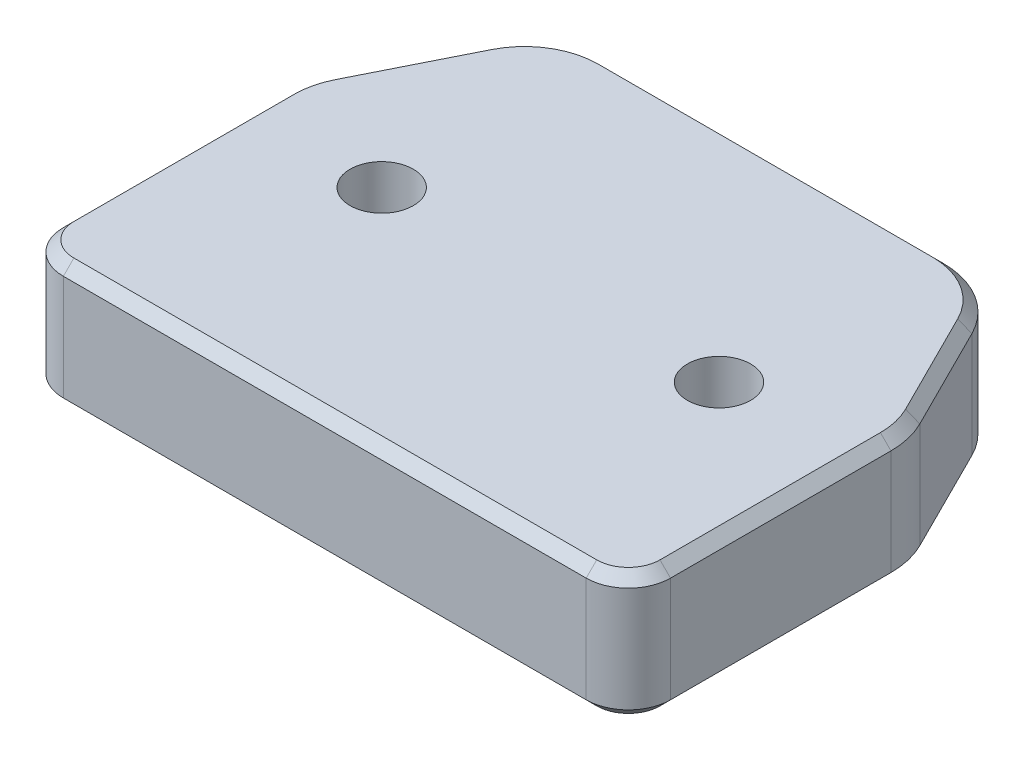
ISO-10303-21;
HEADER;
FILE_DESCRIPTION(('STEP AP214'),'2;1');
FILE_NAME('part.step','',(''),(''),'','','');
FILE_SCHEMA(('AUTOMOTIVE_DESIGN { 1 0 10303 214 1 1 1 1 }'));
ENDSEC;
DATA;
#1=APPLICATION_CONTEXT('core data for automotive mechanical design processes');
#2=APPLICATION_PROTOCOL_DEFINITION('international standard','automotive_design',2000,#1);
#3=PRODUCT_CONTEXT('',#1,'mechanical');
#4=PRODUCT('Part','Part','',(#3));
#5=PRODUCT_RELATED_PRODUCT_CATEGORY('part','',(#4));
#6=PRODUCT_DEFINITION_FORMATION('','',#4);
#7=PRODUCT_DEFINITION_CONTEXT('part definition',#1,'design');
#8=PRODUCT_DEFINITION('design','',#6,#7);
#9=PRODUCT_DEFINITION_SHAPE('','',#8);
#10=(LENGTH_UNIT() NAMED_UNIT(*) SI_UNIT(.MILLI.,.METRE.));
#11=(NAMED_UNIT(*) PLANE_ANGLE_UNIT() SI_UNIT($,.RADIAN.));
#12=(NAMED_UNIT(*) SI_UNIT($,.STERADIAN.) SOLID_ANGLE_UNIT());
#13=UNCERTAINTY_MEASURE_WITH_UNIT(LENGTH_MEASURE(1.E-05),#10,'distance_accuracy_value','');
#14=(GEOMETRIC_REPRESENTATION_CONTEXT(3) GLOBAL_UNCERTAINTY_ASSIGNED_CONTEXT((#13)) GLOBAL_UNIT_ASSIGNED_CONTEXT((#10,
#11,#12)) REPRESENTATION_CONTEXT('',''));
#15=CARTESIAN_POINT('',(0.,0.,0.));
#16=DIRECTION('',(0.,0.,1.));
#17=DIRECTION('',(1.,0.,0.));
#18=AXIS2_PLACEMENT_3D('',#15,#16,#17);
#19=CARTESIAN_POINT('',(12.6,6.,-6.3));
#20=DIRECTION('',(0.894427190999916,0.,-0.447213595499958));
#21=DIRECTION('',(-0.447213595499958,0.,-0.894427190999916));
#22=AXIS2_PLACEMENT_3D('',#19,#20,#21);
#23=PLANE('',#22);
#24=DIRECTION('',(0.,-1.,0.));
#25=VECTOR('',#24,1.);
#26=CARTESIAN_POINT('',(13.9777087639997,0.,-3.54458247200067));
#27=LINE('',#26,#25);
#28=CARTESIAN_POINT('',(13.9777087639997,5.5,-3.54458247200067));
#29=VERTEX_POINT('',#28);
#30=CARTESIAN_POINT('',(13.9777087639997,0.500000000000004,-3.54458247200067));
#31=VERTEX_POINT('',#30);
#32=EDGE_CURVE('E546',#29,#31,#27,.T.);
#33=ORIENTED_EDGE('',*,*,#32,.T.);
#34=DIRECTION('',(-0.447213595499958,0.,-0.894427190999916));
#35=VECTOR('',#34,1.);
#36=CARTESIAN_POINT('',(11.5055728090001,0.500000000000004,-8.48885438199983));
#37=LINE('',#36,#35);
#38=CARTESIAN_POINT('',(11.5055728090001,0.500000000000004,-8.48885438199983));
#39=VERTEX_POINT('',#38);
#40=EDGE_CURVE('E343',#31,#39,#37,.T.);
#41=ORIENTED_EDGE('',*,*,#40,.T.);
#42=DIRECTION('',(0.,-1.,0.));
#43=VECTOR('',#42,1.);
#44=CARTESIAN_POINT('',(11.5055728090001,6.,-8.48885438199983));
#45=LINE('',#44,#43);
#46=CARTESIAN_POINT('',(11.5055728090001,5.5,-8.48885438199983));
#47=VERTEX_POINT('',#46);
#48=EDGE_CURVE('E537',#39,#47,#45,.F.);
#49=ORIENTED_EDGE('',*,*,#48,.T.);
#50=DIRECTION('',(0.447213595499958,0.,0.894427190999916));
#51=VECTOR('',#50,1.);
#52=CARTESIAN_POINT('',(12.6,5.5,-6.3));
#53=LINE('',#52,#51);
#54=EDGE_CURVE('E351',#47,#29,#53,.T.);
#55=ORIENTED_EDGE('',*,*,#54,.T.);
#56=EDGE_LOOP('',(#33,#41,#49,#55));
#57=FACE_BOUND('',#56,.T.);
#58=ADVANCED_FACE('F47',(#57),#23,.T.);
#59=CARTESIAN_POINT('',(0.,6.,-10.7));
#60=DIRECTION('',(0.,0.,-1.));
#61=DIRECTION('',(-1.,0.,0.));
#62=AXIS2_PLACEMENT_3D('',#59,#60,#61);
#63=PLANE('',#62);
#64=DIRECTION('',(0.,-1.,0.));
#65=VECTOR('',#64,1.);
#66=CARTESIAN_POINT('',(7.92786404500042,6.,-10.7));
#67=LINE('',#66,#65);
#68=CARTESIAN_POINT('',(7.92786404500042,5.5,-10.7));
#69=VERTEX_POINT('',#68);
#70=CARTESIAN_POINT('',(7.92786404500042,0.500000000000004,-10.7));
#71=VERTEX_POINT('',#70);
#72=EDGE_CURVE('E553',#69,#71,#67,.T.);
#73=ORIENTED_EDGE('',*,*,#72,.T.);
#74=DIRECTION('',(-1.,0.,0.));
#75=VECTOR('',#74,1.);
#76=CARTESIAN_POINT('',(-7.92786404500042,0.500000000000004,-10.7));
#77=LINE('',#76,#75);
#78=CARTESIAN_POINT('',(-7.92786404500042,0.500000000000004,-10.7));
#79=VERTEX_POINT('',#78);
#80=EDGE_CURVE('E447',#71,#79,#77,.T.);
#81=ORIENTED_EDGE('',*,*,#80,.T.);
#82=DIRECTION('',(0.,-1.,0.));
#83=VECTOR('',#82,1.);
#84=CARTESIAN_POINT('',(-7.92786404500042,6.,-10.7));
#85=LINE('',#84,#83);
#86=CARTESIAN_POINT('',(-7.92786404500042,5.5,-10.7));
#87=VERTEX_POINT('',#86);
#88=EDGE_CURVE('E557',#79,#87,#85,.F.);
#89=ORIENTED_EDGE('',*,*,#88,.T.);
#90=DIRECTION('',(1.,0.,0.));
#91=VECTOR('',#90,1.);
#92=CARTESIAN_POINT('',(0.,5.5,-10.7));
#93=LINE('',#92,#91);
#94=EDGE_CURVE('E444',#87,#69,#93,.T.);
#95=ORIENTED_EDGE('',*,*,#94,.T.);
#96=EDGE_LOOP('',(#73,#81,#89,#95));
#97=FACE_BOUND('',#96,.T.);
#98=ADVANCED_FACE('F616',(#97),#63,.T.);
#99=CARTESIAN_POINT('',(-12.6,6.,-6.3));
#100=DIRECTION('',(-0.894427190999916,0.,-0.447213595499958));
#101=DIRECTION('',(-0.447213595499958,0.,0.894427190999916));
#102=AXIS2_PLACEMENT_3D('',#99,#100,#101);
#103=PLANE('',#102);
#104=DIRECTION('',(0.,-1.,0.));
#105=VECTOR('',#104,1.);
#106=CARTESIAN_POINT('',(-11.5055728090001,6.,-8.48885438199983));
#107=LINE('',#106,#105);
#108=CARTESIAN_POINT('',(-11.5055728090001,5.5,-8.48885438199983));
#109=VERTEX_POINT('',#108);
#110=CARTESIAN_POINT('',(-11.5055728090001,0.500000000000004,-8.48885438199983));
#111=VERTEX_POINT('',#110);
#112=EDGE_CURVE('E524',#109,#111,#107,.T.);
#113=ORIENTED_EDGE('',*,*,#112,.T.);
#114=DIRECTION('',(-0.447213595499958,0.,0.894427190999916));
#115=VECTOR('',#114,1.);
#116=CARTESIAN_POINT('',(-13.9777087639997,0.500000000000004,-3.54458247200066));
#117=LINE('',#116,#115);
#118=CARTESIAN_POINT('',(-13.9777087639997,0.500000000000004,-3.54458247200066));
#119=VERTEX_POINT('',#118);
#120=EDGE_CURVE('E422',#111,#119,#117,.T.);
#121=ORIENTED_EDGE('',*,*,#120,.T.);
#122=DIRECTION('',(0.,-1.,0.));
#123=VECTOR('',#122,1.);
#124=CARTESIAN_POINT('',(-13.9777087639997,6.,-3.54458247200066));
#125=LINE('',#124,#123);
#126=CARTESIAN_POINT('',(-13.9777087639997,5.5,-3.54458247200066));
#127=VERTEX_POINT('',#126);
#128=EDGE_CURVE('E525',#119,#127,#125,.F.);
#129=ORIENTED_EDGE('',*,*,#128,.T.);
#130=DIRECTION('',(0.447213595499958,0.,-0.894427190999916));
#131=VECTOR('',#130,1.);
#132=CARTESIAN_POINT('',(-12.6,5.5,-6.3));
#133=LINE('',#132,#131);
#134=EDGE_CURVE('E429',#127,#109,#133,.T.);
#135=ORIENTED_EDGE('',*,*,#134,.T.);
#136=EDGE_LOOP('',(#113,#121,#129,#135));
#137=FACE_BOUND('',#136,.T.);
#138=ADVANCED_FACE('F523',(#137),#103,.T.);
#139=CARTESIAN_POINT('',(-14.4,6.,0.));
#140=DIRECTION('',(-1.,0.,0.));
#141=DIRECTION('',(0.,0.,1.));
#142=AXIS2_PLACEMENT_3D('',#139,#140,#141);
#143=PLANE('',#142);
#144=DIRECTION('',(0.,-1.,0.));
#145=VECTOR('',#144,1.);
#146=CARTESIAN_POINT('',(-14.4,6.,-1.75572809000083));
#147=LINE('',#146,#145);
#148=CARTESIAN_POINT('',(-14.4,5.5,-1.75572809000083));
#149=VERTEX_POINT('',#148);
#150=CARTESIAN_POINT('',(-14.4,0.500000000000004,-1.75572809000083));
#151=VERTEX_POINT('',#150);
#152=EDGE_CURVE('E533',#149,#151,#147,.T.);
#153=ORIENTED_EDGE('',*,*,#152,.T.);
#154=DIRECTION('',(0.,0.,1.));
#155=VECTOR('',#154,1.);
#156=CARTESIAN_POINT('',(-14.4,0.500000000000004,8.7));
#157=LINE('',#156,#155);
#158=CARTESIAN_POINT('',(-14.4,0.500000000000004,8.7));
#159=VERTEX_POINT('',#158);
#160=EDGE_CURVE('E441',#151,#159,#157,.T.);
#161=ORIENTED_EDGE('',*,*,#160,.T.);
#162=DIRECTION('',(0.,-1.,0.));
#163=VECTOR('',#162,1.);
#164=CARTESIAN_POINT('',(-14.4,6.,8.7));
#165=LINE('',#164,#163);
#166=CARTESIAN_POINT('',(-14.4,5.5,8.7));
#167=VERTEX_POINT('',#166);
#168=EDGE_CURVE('E237',#159,#167,#165,.F.);
#169=ORIENTED_EDGE('',*,*,#168,.T.);
#170=DIRECTION('',(0.,0.,-1.));
#171=VECTOR('',#170,1.);
#172=CARTESIAN_POINT('',(-14.4,5.5,0.));
#173=LINE('',#172,#171);
#174=EDGE_CURVE('E438',#167,#149,#173,.T.);
#175=ORIENTED_EDGE('',*,*,#174,.T.);
#176=EDGE_LOOP('',(#153,#161,#169,#175));
#177=FACE_BOUND('',#176,.T.);
#178=ADVANCED_FACE('F570',(#177),#143,.T.);
#179=CARTESIAN_POINT('',(0.,6.,10.7));
#180=DIRECTION('',(0.,0.,-1.));
#181=DIRECTION('',(-1.,0.,0.));
#182=AXIS2_PLACEMENT_3D('',#179,#180,#181);
#183=PLANE('',#182);
#184=DIRECTION('',(0.,-1.,0.));
#185=VECTOR('',#184,1.);
#186=CARTESIAN_POINT('',(-12.4,0.,10.7));
#187=LINE('',#186,#185);
#188=CARTESIAN_POINT('',(-12.4,5.5,10.7));
#189=VERTEX_POINT('',#188);
#190=CARTESIAN_POINT('',(-12.4,0.500000000000004,10.7));
#191=VERTEX_POINT('',#190);
#192=EDGE_CURVE('E474',#189,#191,#187,.T.);
#193=ORIENTED_EDGE('',*,*,#192,.T.);
#194=DIRECTION('',(1.,0.,0.));
#195=VECTOR('',#194,1.);
#196=CARTESIAN_POINT('',(0.,0.500000000000004,10.7));
#197=LINE('',#196,#195);
#198=CARTESIAN_POINT('',(12.4,0.500000000000004,10.7));
#199=VERTEX_POINT('',#198);
#200=EDGE_CURVE('E357',#191,#199,#197,.T.);
#201=ORIENTED_EDGE('',*,*,#200,.T.);
#202=DIRECTION('',(0.,-1.,0.));
#203=VECTOR('',#202,1.);
#204=CARTESIAN_POINT('',(12.4,6.,10.7));
#205=LINE('',#204,#203);
#206=CARTESIAN_POINT('',(12.4,5.5,10.7));
#207=VERTEX_POINT('',#206);
#208=EDGE_CURVE('E471',#199,#207,#205,.F.);
#209=ORIENTED_EDGE('',*,*,#208,.T.);
#210=DIRECTION('',(-1.,0.,0.));
#211=VECTOR('',#210,1.);
#212=CARTESIAN_POINT('',(-12.4,5.5,10.7));
#213=LINE('',#212,#211);
#214=EDGE_CURVE('E462',#207,#189,#213,.T.);
#215=ORIENTED_EDGE('',*,*,#214,.T.);
#216=EDGE_LOOP('',(#193,#201,#209,#215));
#217=FACE_BOUND('',#216,.T.);
#218=ADVANCED_FACE('F470',(#217),#183,.F.);
#219=CARTESIAN_POINT('',(14.4,6.,0.));
#220=DIRECTION('',(-1.,0.,0.));
#221=DIRECTION('',(0.,0.,1.));
#222=AXIS2_PLACEMENT_3D('',#219,#220,#221);
#223=PLANE('',#222);
#224=DIRECTION('',(0.,-1.,0.));
#225=VECTOR('',#224,1.);
#226=CARTESIAN_POINT('',(14.4,6.,8.7));
#227=LINE('',#226,#225);
#228=CARTESIAN_POINT('',(14.4,5.5,8.7));
#229=VERTEX_POINT('',#228);
#230=CARTESIAN_POINT('',(14.4,0.500000000000004,8.7));
#231=VERTEX_POINT('',#230);
#232=EDGE_CURVE('E560',#229,#231,#227,.T.);
#233=ORIENTED_EDGE('',*,*,#232,.T.);
#234=DIRECTION('',(0.,0.,-1.));
#235=VECTOR('',#234,1.);
#236=CARTESIAN_POINT('',(14.4,0.500000000000004,0.));
#237=LINE('',#236,#235);
#238=CARTESIAN_POINT('',(14.4,0.500000000000004,-1.75572809000084));
#239=VERTEX_POINT('',#238);
#240=EDGE_CURVE('E371',#231,#239,#237,.T.);
#241=ORIENTED_EDGE('',*,*,#240,.T.);
#242=DIRECTION('',(0.,-1.,0.));
#243=VECTOR('',#242,1.);
#244=CARTESIAN_POINT('',(14.4,6.,-1.75572809000084));
#245=LINE('',#244,#243);
#246=CARTESIAN_POINT('',(14.4,5.5,-1.75572809000084));
#247=VERTEX_POINT('',#246);
#248=EDGE_CURVE('E549',#239,#247,#245,.F.);
#249=ORIENTED_EDGE('',*,*,#248,.T.);
#250=DIRECTION('',(0.,0.,1.));
#251=VECTOR('',#250,1.);
#252=CARTESIAN_POINT('',(14.4,5.5,8.7));
#253=LINE('',#252,#251);
#254=EDGE_CURVE('E368',#247,#229,#253,.T.);
#255=ORIENTED_EDGE('',*,*,#254,.T.);
#256=EDGE_LOOP('',(#233,#241,#249,#255));
#257=FACE_BOUND('',#256,.T.);
#258=ADVANCED_FACE('F731',(#257),#223,.F.);
#259=CARTESIAN_POINT('',(0.,6.,0.));
#260=DIRECTION('',(0.,1.,0.));
#261=DIRECTION('',(0.,0.,1.));
#262=AXIS2_PLACEMENT_3D('',#259,#260,#261);
#263=PLANE('',#262);
#264=CARTESIAN_POINT('',(-7.92786404500042,6.,-6.7));
#265=DIRECTION('',(0.,1.,0.));
#266=DIRECTION('',(0.,0.,1.));
#267=AXIS2_PLACEMENT_3D('',#264,#265,#266);
#268=CIRCLE('',#267,3.5);
#269=CARTESIAN_POINT('',(-7.92786404500042,6.,-10.2));
#270=VERTEX_POINT('',#269);
#271=CARTESIAN_POINT('',(-11.0583592135001,6.,-8.26524758424985));
#272=VERTEX_POINT('',#271);
#273=EDGE_CURVE('E73',#270,#272,#268,.T.);
#274=ORIENTED_EDGE('',*,*,#273,.T.);
#275=DIRECTION('',(-0.447213595499958,0.,0.894427190999916));
#276=VECTOR('',#275,1.);
#277=CARTESIAN_POINT('',(-12.1527864045,6.,-6.07639320225002));
#278=LINE('',#277,#276);
#279=CARTESIAN_POINT('',(-13.5304951684997,6.,-3.32097567425069));
#280=VERTEX_POINT('',#279);
#281=EDGE_CURVE('E11',#272,#280,#278,.T.);
#282=ORIENTED_EDGE('',*,*,#281,.T.);
#283=CARTESIAN_POINT('',(-10.4,6.,-1.75572809000083));
#284=DIRECTION('',(0.,1.,0.));
#285=DIRECTION('',(0.,0.,1.));
#286=AXIS2_PLACEMENT_3D('',#283,#284,#285);
#287=CIRCLE('',#286,3.5);
#288=CARTESIAN_POINT('',(-13.9,6.,-1.75572809000083));
#289=VERTEX_POINT('',#288);
#290=EDGE_CURVE('E58',#280,#289,#287,.T.);
#291=ORIENTED_EDGE('',*,*,#290,.T.);
#292=DIRECTION('',(0.,0.,1.));
#293=VECTOR('',#292,1.);
#294=CARTESIAN_POINT('',(-13.9,6.,0.));
#295=LINE('',#294,#293);
#296=CARTESIAN_POINT('',(-13.9,6.,8.7));
#297=VERTEX_POINT('',#296);
#298=EDGE_CURVE('E398',#289,#297,#295,.T.);
#299=ORIENTED_EDGE('',*,*,#298,.T.);
#300=CARTESIAN_POINT('',(-12.4,6.,8.7));
#301=DIRECTION('',(0.,1.,0.));
#302=DIRECTION('',(0.,0.,1.));
#303=AXIS2_PLACEMENT_3D('',#300,#301,#302);
#304=CIRCLE('',#303,1.5);
#305=CARTESIAN_POINT('',(-12.4,6.,10.2));
#306=VERTEX_POINT('',#305);
#307=EDGE_CURVE('E392',#297,#306,#304,.T.);
#308=ORIENTED_EDGE('',*,*,#307,.T.);
#309=DIRECTION('',(1.,0.,0.));
#310=VECTOR('',#309,1.);
#311=CARTESIAN_POINT('',(12.4,6.,10.2));
#312=LINE('',#311,#310);
#313=CARTESIAN_POINT('',(12.4,6.,10.2));
#314=VERTEX_POINT('',#313);
#315=EDGE_CURVE('E386',#306,#314,#312,.T.);
#316=ORIENTED_EDGE('',*,*,#315,.T.);
#317=CARTESIAN_POINT('',(12.4,6.,8.7));
#318=DIRECTION('',(0.,1.,0.));
#319=DIRECTION('',(0.,0.,1.));
#320=AXIS2_PLACEMENT_3D('',#317,#318,#319);
#321=CIRCLE('',#320,1.5);
#322=CARTESIAN_POINT('',(13.9,6.,8.7));
#323=VERTEX_POINT('',#322);
#324=EDGE_CURVE('E380',#314,#323,#321,.T.);
#325=ORIENTED_EDGE('',*,*,#324,.T.);
#326=DIRECTION('',(0.,0.,-1.));
#327=VECTOR('',#326,1.);
#328=CARTESIAN_POINT('',(13.9,6.,-1.75572809000084));
#329=LINE('',#328,#327);
#330=CARTESIAN_POINT('',(13.9,6.,-1.75572809000084));
#331=VERTEX_POINT('',#330);
#332=EDGE_CURVE('E374',#323,#331,#329,.T.);
#333=ORIENTED_EDGE('',*,*,#332,.T.);
#334=CARTESIAN_POINT('',(10.4,6.,-1.75572809000084));
#335=DIRECTION('',(0.,1.,0.));
#336=DIRECTION('',(0.,0.,1.));
#337=AXIS2_PLACEMENT_3D('',#334,#335,#336);
#338=CIRCLE('',#337,3.5);
#339=CARTESIAN_POINT('',(13.5304951684997,6.,-3.32097567425069));
#340=VERTEX_POINT('',#339);
#341=EDGE_CURVE('E377',#331,#340,#338,.T.);
#342=ORIENTED_EDGE('',*,*,#341,.T.);
#343=DIRECTION('',(-0.447213595499958,0.,-0.894427190999916));
#344=VECTOR('',#343,1.);
#345=CARTESIAN_POINT('',(12.1527864045,6.,-6.07639320225002));
#346=LINE('',#345,#344);
#347=CARTESIAN_POINT('',(11.0583592135001,6.,-8.26524758424985));
#348=VERTEX_POINT('',#347);
#349=EDGE_CURVE('E383',#340,#348,#346,.T.);
#350=ORIENTED_EDGE('',*,*,#349,.T.);
#351=CARTESIAN_POINT('',(7.92786404500042,6.,-6.7));
#352=DIRECTION('',(0.,1.,0.));
#353=DIRECTION('',(0.,0.,1.));
#354=AXIS2_PLACEMENT_3D('',#351,#352,#353);
#355=CIRCLE('',#354,3.5);
#356=CARTESIAN_POINT('',(7.92786404500042,6.,-10.2));
#357=VERTEX_POINT('',#356);
#358=EDGE_CURVE('E389',#348,#357,#355,.T.);
#359=ORIENTED_EDGE('',*,*,#358,.T.);
#360=DIRECTION('',(-1.,0.,0.));
#361=VECTOR('',#360,1.);
#362=CARTESIAN_POINT('',(0.,6.,-10.2));
#363=LINE('',#362,#361);
#364=EDGE_CURVE('E395',#357,#270,#363,.T.);
#365=ORIENTED_EDGE('',*,*,#364,.T.);
#366=EDGE_LOOP('',(#274,#282,#291,#299,#308,#316,#325,#333,#342,#350,#359,#365));
#367=FACE_BOUND('',#366,.T.);
#368=CARTESIAN_POINT('',(-8.,6.,0.));
#369=DIRECTION('',(0.,-1.,0.));
#370=DIRECTION('',(0.,0.,-1.));
#371=AXIS2_PLACEMENT_3D('',#368,#369,#370);
#372=CIRCLE('',#371,1.5);
#373=CARTESIAN_POINT('',(-8.,6.,-1.5));
#374=VERTEX_POINT('',#373);
#375=EDGE_CURVE('E540',#374,#374,#372,.T.);
#376=ORIENTED_EDGE('',*,*,#375,.T.);
#377=EDGE_LOOP('',(#376));
#378=FACE_BOUND('',#377,.T.);
#379=CARTESIAN_POINT('',(8.,6.,0.));
#380=DIRECTION('',(0.,-1.,0.));
#381=DIRECTION('',(0.,0.,-1.));
#382=AXIS2_PLACEMENT_3D('',#379,#380,#381);
#383=CIRCLE('',#382,1.5);
#384=CARTESIAN_POINT('',(8.,6.,-1.5));
#385=VERTEX_POINT('',#384);
#386=EDGE_CURVE('E246',#385,#385,#383,.T.);
#387=ORIENTED_EDGE('',*,*,#386,.T.);
#388=EDGE_LOOP('',(#387));
#389=FACE_BOUND('',#388,.T.);
#390=ADVANCED_FACE('F404',(#367,#378,#389),#263,.T.);
#391=CARTESIAN_POINT('',(0.,0.,0.));
#392=DIRECTION('',(0.,1.,0.));
#393=DIRECTION('',(0.,0.,1.));
#394=AXIS2_PLACEMENT_3D('',#391,#392,#393);
#395=PLANE('',#394);
#396=CARTESIAN_POINT('',(-10.4,0.,-1.75572809000083));
#397=DIRECTION('',(0.,1.,0.));
#398=DIRECTION('',(0.,0.,1.));
#399=AXIS2_PLACEMENT_3D('',#396,#397,#398);
#400=CIRCLE('',#399,3.5);
#401=CARTESIAN_POINT('',(-13.9,0.,-1.75572809000083));
#402=VERTEX_POINT('',#401);
#403=CARTESIAN_POINT('',(-13.5304951684997,0.,-3.32097567425068));
#404=VERTEX_POINT('',#403);
#405=EDGE_CURVE('E512',#402,#404,#400,.F.);
#406=ORIENTED_EDGE('',*,*,#405,.T.);
#407=DIRECTION('',(0.447213595499958,0.,-0.894427190999916));
#408=VECTOR('',#407,1.);
#409=CARTESIAN_POINT('',(-11.0583592135001,0.,-8.26524758424985));
#410=LINE('',#409,#408);
#411=CARTESIAN_POINT('',(-11.0583592135001,0.,-8.26524758424985));
#412=VERTEX_POINT('',#411);
#413=EDGE_CURVE('E515',#404,#412,#410,.T.);
#414=ORIENTED_EDGE('',*,*,#413,.T.);
#415=CARTESIAN_POINT('',(-7.92786404500042,0.,-6.7));
#416=DIRECTION('',(0.,1.,0.));
#417=DIRECTION('',(0.,0.,1.));
#418=AXIS2_PLACEMENT_3D('',#415,#416,#417);
#419=CIRCLE('',#418,3.5);
#420=CARTESIAN_POINT('',(-7.92786404500042,0.,-10.2));
#421=VERTEX_POINT('',#420);
#422=EDGE_CURVE('E509',#412,#421,#419,.F.);
#423=ORIENTED_EDGE('',*,*,#422,.T.);
#424=DIRECTION('',(1.,0.,0.));
#425=VECTOR('',#424,1.);
#426=CARTESIAN_POINT('',(7.92786404500042,0.,-10.2));
#427=LINE('',#426,#425);
#428=CARTESIAN_POINT('',(7.92786404500042,0.,-10.2));
#429=VERTEX_POINT('',#428);
#430=EDGE_CURVE('E503',#421,#429,#427,.T.);
#431=ORIENTED_EDGE('',*,*,#430,.T.);
#432=CARTESIAN_POINT('',(7.92786404500042,0.,-6.7));
#433=DIRECTION('',(0.,1.,0.));
#434=DIRECTION('',(0.,0.,1.));
#435=AXIS2_PLACEMENT_3D('',#432,#433,#434);
#436=CIRCLE('',#435,3.5);
#437=CARTESIAN_POINT('',(11.0583592135001,0.,-8.26524758424985));
#438=VERTEX_POINT('',#437);
#439=EDGE_CURVE('E492',#429,#438,#436,.F.);
#440=ORIENTED_EDGE('',*,*,#439,.T.);
#441=DIRECTION('',(0.447213595499958,0.,0.894427190999916));
#442=VECTOR('',#441,1.);
#443=CARTESIAN_POINT('',(13.5304951684997,0.,-3.32097567425069));
#444=LINE('',#443,#442);
#445=CARTESIAN_POINT('',(13.5304951684997,0.,-3.32097567425069));
#446=VERTEX_POINT('',#445);
#447=EDGE_CURVE('E219',#438,#446,#444,.T.);
#448=ORIENTED_EDGE('',*,*,#447,.T.);
#449=CARTESIAN_POINT('',(10.4,0.,-1.75572809000084));
#450=DIRECTION('',(0.,1.,0.));
#451=DIRECTION('',(0.,0.,1.));
#452=AXIS2_PLACEMENT_3D('',#449,#450,#451);
#453=CIRCLE('',#452,3.5);
#454=CARTESIAN_POINT('',(13.9,0.,-1.75572809000084));
#455=VERTEX_POINT('',#454);
#456=EDGE_CURVE('E212',#446,#455,#453,.F.);
#457=ORIENTED_EDGE('',*,*,#456,.T.);
#458=DIRECTION('',(0.,0.,1.));
#459=VECTOR('',#458,1.);
#460=CARTESIAN_POINT('',(13.9,0.,0.));
#461=LINE('',#460,#459);
#462=CARTESIAN_POINT('',(13.9,0.,8.7));
#463=VERTEX_POINT('',#462);
#464=EDGE_CURVE('E216',#455,#463,#461,.T.);
#465=ORIENTED_EDGE('',*,*,#464,.T.);
#466=CARTESIAN_POINT('',(12.4,0.,8.7));
#467=DIRECTION('',(0.,1.,0.));
#468=DIRECTION('',(0.,0.,1.));
#469=AXIS2_PLACEMENT_3D('',#466,#467,#468);
#470=CIRCLE('',#469,1.5);
#471=CARTESIAN_POINT('',(12.4,0.,10.2));
#472=VERTEX_POINT('',#471);
#473=EDGE_CURVE('E225',#463,#472,#470,.F.);
#474=ORIENTED_EDGE('',*,*,#473,.T.);
#475=DIRECTION('',(-1.,0.,0.));
#476=VECTOR('',#475,1.);
#477=CARTESIAN_POINT('',(0.,0.,10.2));
#478=LINE('',#477,#476);
#479=CARTESIAN_POINT('',(-12.4,0.,10.2));
#480=VERTEX_POINT('',#479);
#481=EDGE_CURVE('E489',#472,#480,#478,.T.);
#482=ORIENTED_EDGE('',*,*,#481,.T.);
#483=CARTESIAN_POINT('',(-12.4,0.,8.7));
#484=DIRECTION('',(0.,1.,0.));
#485=DIRECTION('',(0.,0.,1.));
#486=AXIS2_PLACEMENT_3D('',#483,#484,#485);
#487=CIRCLE('',#486,1.5);
#488=CARTESIAN_POINT('',(-13.9,0.,8.7));
#489=VERTEX_POINT('',#488);
#490=EDGE_CURVE('E496',#480,#489,#487,.F.);
#491=ORIENTED_EDGE('',*,*,#490,.T.);
#492=DIRECTION('',(0.,0.,-1.));
#493=VECTOR('',#492,1.);
#494=CARTESIAN_POINT('',(-13.9,0.,-1.75572809000083));
#495=LINE('',#494,#493);
#496=EDGE_CURVE('E506',#489,#402,#495,.T.);
#497=ORIENTED_EDGE('',*,*,#496,.T.);
#498=EDGE_LOOP('',(#406,#414,#423,#431,#440,#448,#457,#465,#474,#482,#491,#497));
#499=FACE_BOUND('',#498,.T.);
#500=CARTESIAN_POINT('',(-8.,0.,0.));
#501=DIRECTION('',(0.,-1.,0.));
#502=DIRECTION('',(0.,0.,-1.));
#503=AXIS2_PLACEMENT_3D('',#500,#501,#502);
#504=CIRCLE('',#503,1.5);
#505=CARTESIAN_POINT('',(-8.,0.,-1.5));
#506=VERTEX_POINT('',#505);
#507=EDGE_CURVE('E1042',#506,#506,#504,.T.);
#508=ORIENTED_EDGE('',*,*,#507,.F.);
#509=EDGE_LOOP('',(#508));
#510=FACE_BOUND('',#509,.T.);
#511=CARTESIAN_POINT('',(8.,0.,0.));
#512=DIRECTION('',(0.,-1.,0.));
#513=DIRECTION('',(0.,0.,-1.));
#514=AXIS2_PLACEMENT_3D('',#511,#512,#513);
#515=CIRCLE('',#514,1.5);
#516=CARTESIAN_POINT('',(8.,0.,-1.5));
#517=VERTEX_POINT('',#516);
#518=EDGE_CURVE('E1044',#517,#517,#515,.T.);
#519=ORIENTED_EDGE('',*,*,#518,.F.);
#520=EDGE_LOOP('',(#519));
#521=FACE_BOUND('',#520,.T.);
#522=ADVANCED_FACE('F214',(#499,#510,#521),#395,.F.);
#523=CARTESIAN_POINT('',(-10.4,6.,-1.75572809000083));
#524=DIRECTION('',(0.,-1.,0.));
#525=DIRECTION('',(0.,0.,-1.));
#526=AXIS2_PLACEMENT_3D('',#523,#524,#525);
#527=CYLINDRICAL_SURFACE('',#526,4.);
#528=ORIENTED_EDGE('',*,*,#128,.F.);
#529=CARTESIAN_POINT('',(-10.4,0.500000000000004,-1.75572809000083));
#530=DIRECTION('',(0.,1.,0.));
#531=DIRECTION('',(0.,0.,1.));
#532=AXIS2_PLACEMENT_3D('',#529,#530,#531);
#533=CIRCLE('',#532,4.);
#534=EDGE_CURVE('E421',#119,#151,#533,.T.);
#535=ORIENTED_EDGE('',*,*,#534,.T.);
#536=ORIENTED_EDGE('',*,*,#152,.F.);
#537=CARTESIAN_POINT('',(-10.4,5.5,-1.75572809000083));
#538=DIRECTION('',(0.,1.,0.));
#539=DIRECTION('',(0.,0.,1.));
#540=AXIS2_PLACEMENT_3D('',#537,#538,#539);
#541=CIRCLE('',#540,4.);
#542=EDGE_CURVE('E415',#149,#127,#541,.F.);
#543=ORIENTED_EDGE('',*,*,#542,.T.);
#544=EDGE_LOOP('',(#528,#535,#536,#543));
#545=FACE_BOUND('',#544,.T.);
#546=ADVANCED_FACE('F626',(#545),#527,.T.);
#547=CARTESIAN_POINT('',(10.4,6.,-1.75572809000084));
#548=DIRECTION('',(0.,1.,0.));
#549=DIRECTION('',(0.,0.,1.));
#550=AXIS2_PLACEMENT_3D('',#547,#548,#549);
#551=CYLINDRICAL_SURFACE('',#550,4.);
#552=ORIENTED_EDGE('',*,*,#248,.F.);
#553=CARTESIAN_POINT('',(10.4,0.500000000000004,-1.75572809000084));
#554=DIRECTION('',(0.,1.,0.));
#555=DIRECTION('',(0.,0.,1.));
#556=AXIS2_PLACEMENT_3D('',#553,#554,#555);
#557=CIRCLE('',#556,4.);
#558=EDGE_CURVE('E240',#239,#31,#557,.T.);
#559=ORIENTED_EDGE('',*,*,#558,.T.);
#560=ORIENTED_EDGE('',*,*,#32,.F.);
#561=CARTESIAN_POINT('',(10.4,5.5,-1.75572809000084));
#562=DIRECTION('',(0.,1.,0.));
#563=DIRECTION('',(0.,0.,1.));
#564=AXIS2_PLACEMENT_3D('',#561,#562,#563);
#565=CIRCLE('',#564,4.);
#566=EDGE_CURVE('E363',#29,#247,#565,.F.);
#567=ORIENTED_EDGE('',*,*,#566,.T.);
#568=EDGE_LOOP('',(#552,#559,#560,#567));
#569=FACE_BOUND('',#568,.T.);
#570=ADVANCED_FACE('F629',(#569),#551,.T.);
#571=CARTESIAN_POINT('',(-7.92786404500042,6.,-6.7));
#572=DIRECTION('',(0.,-1.,0.));
#573=DIRECTION('',(0.,0.,-1.));
#574=AXIS2_PLACEMENT_3D('',#571,#572,#573);
#575=CYLINDRICAL_SURFACE('',#574,4.);
#576=ORIENTED_EDGE('',*,*,#88,.F.);
#577=CARTESIAN_POINT('',(-7.92786404500042,0.500000000000004,-6.7));
#578=DIRECTION('',(0.,1.,0.));
#579=DIRECTION('',(0.,0.,1.));
#580=AXIS2_PLACEMENT_3D('',#577,#578,#579);
#581=CIRCLE('',#580,4.);
#582=EDGE_CURVE('E435',#79,#111,#581,.T.);
#583=ORIENTED_EDGE('',*,*,#582,.T.);
#584=ORIENTED_EDGE('',*,*,#112,.F.);
#585=CARTESIAN_POINT('',(-7.92786404500042,5.5,-6.7));
#586=DIRECTION('',(0.,1.,0.));
#587=DIRECTION('',(0.,0.,1.));
#588=AXIS2_PLACEMENT_3D('',#585,#586,#587);
#589=CIRCLE('',#588,4.);
#590=EDGE_CURVE('E426',#109,#87,#589,.F.);
#591=ORIENTED_EDGE('',*,*,#590,.T.);
#592=EDGE_LOOP('',(#576,#583,#584,#591));
#593=FACE_BOUND('',#592,.T.);
#594=ADVANCED_FACE('F528',(#593),#575,.T.);
#595=CARTESIAN_POINT('',(7.92786404500042,6.,-6.7));
#596=DIRECTION('',(0.,-1.,0.));
#597=DIRECTION('',(0.,0.,-1.));
#598=AXIS2_PLACEMENT_3D('',#595,#596,#597);
#599=CYLINDRICAL_SURFACE('',#598,4.);
#600=ORIENTED_EDGE('',*,*,#48,.F.);
#601=CARTESIAN_POINT('',(7.92786404500042,0.500000000000004,-6.7));
#602=DIRECTION('',(0.,1.,0.));
#603=DIRECTION('',(0.,0.,1.));
#604=AXIS2_PLACEMENT_3D('',#601,#602,#603);
#605=CIRCLE('',#604,4.);
#606=EDGE_CURVE('E459',#39,#71,#605,.T.);
#607=ORIENTED_EDGE('',*,*,#606,.T.);
#608=ORIENTED_EDGE('',*,*,#72,.F.);
#609=CARTESIAN_POINT('',(7.92786404500042,5.5,-6.7));
#610=DIRECTION('',(0.,1.,0.));
#611=DIRECTION('',(0.,0.,1.));
#612=AXIS2_PLACEMENT_3D('',#609,#610,#611);
#613=CIRCLE('',#612,4.);
#614=EDGE_CURVE('E456',#69,#47,#613,.F.);
#615=ORIENTED_EDGE('',*,*,#614,.T.);
#616=EDGE_LOOP('',(#600,#607,#608,#615));
#617=FACE_BOUND('',#616,.T.);
#618=ADVANCED_FACE('F635',(#617),#599,.T.);
#619=CARTESIAN_POINT('',(12.4,6.,8.7));
#620=DIRECTION('',(0.,-1.,0.));
#621=DIRECTION('',(0.,0.,-1.));
#622=AXIS2_PLACEMENT_3D('',#619,#620,#621);
#623=CYLINDRICAL_SURFACE('',#622,2.);
#624=ORIENTED_EDGE('',*,*,#208,.F.);
#625=CARTESIAN_POINT('',(12.4,0.500000000000004,8.7));
#626=DIRECTION('',(0.,1.,0.));
#627=DIRECTION('',(0.,0.,1.));
#628=AXIS2_PLACEMENT_3D('',#625,#626,#627);
#629=CIRCLE('',#628,2.);
#630=EDGE_CURVE('E355',#199,#231,#629,.T.);
#631=ORIENTED_EDGE('',*,*,#630,.T.);
#632=ORIENTED_EDGE('',*,*,#232,.F.);
#633=CARTESIAN_POINT('',(12.4,5.5,8.7));
#634=DIRECTION('',(0.,1.,0.));
#635=DIRECTION('',(0.,0.,1.));
#636=AXIS2_PLACEMENT_3D('',#633,#634,#635);
#637=CIRCLE('',#636,2.);
#638=EDGE_CURVE('E350',#229,#207,#637,.F.);
#639=ORIENTED_EDGE('',*,*,#638,.T.);
#640=EDGE_LOOP('',(#624,#631,#632,#639));
#641=FACE_BOUND('',#640,.T.);
#642=ADVANCED_FACE('F479',(#641),#623,.T.);
#643=CARTESIAN_POINT('',(-12.4,6.,8.7));
#644=DIRECTION('',(0.,1.,0.));
#645=DIRECTION('',(0.,0.,1.));
#646=AXIS2_PLACEMENT_3D('',#643,#644,#645);
#647=CYLINDRICAL_SURFACE('',#646,2.);
#648=ORIENTED_EDGE('',*,*,#168,.F.);
#649=CARTESIAN_POINT('',(-12.4,0.500000000000004,8.7));
#650=DIRECTION('',(0.,1.,0.));
#651=DIRECTION('',(0.,0.,1.));
#652=AXIS2_PLACEMENT_3D('',#649,#650,#651);
#653=CIRCLE('',#652,2.);
#654=EDGE_CURVE('E453',#159,#191,#653,.T.);
#655=ORIENTED_EDGE('',*,*,#654,.T.);
#656=ORIENTED_EDGE('',*,*,#192,.F.);
#657=CARTESIAN_POINT('',(-12.4,5.5,8.7));
#658=DIRECTION('',(0.,1.,0.));
#659=DIRECTION('',(0.,0.,1.));
#660=AXIS2_PLACEMENT_3D('',#657,#658,#659);
#661=CIRCLE('',#660,2.);
#662=EDGE_CURVE('E450',#189,#167,#661,.F.);
#663=ORIENTED_EDGE('',*,*,#662,.T.);
#664=EDGE_LOOP('',(#648,#655,#656,#663));
#665=FACE_BOUND('',#664,.T.);
#666=ADVANCED_FACE('F641',(#665),#647,.T.);
#667=CARTESIAN_POINT('',(8.,6.,0.));
#668=DIRECTION('',(0.,-1.,0.));
#669=DIRECTION('',(0.,0.,-1.));
#670=AXIS2_PLACEMENT_3D('',#667,#668,#669);
#671=CYLINDRICAL_SURFACE('',#670,1.5);
#672=ORIENTED_EDGE('',*,*,#386,.F.);
#673=EDGE_LOOP('',(#672));
#674=FACE_BOUND('',#673,.T.);
#675=ORIENTED_EDGE('',*,*,#518,.T.);
#676=EDGE_LOOP('',(#675));
#677=FACE_BOUND('',#676,.T.);
#678=ADVANCED_FACE('F644',(#674,#677),#671,.F.);
#679=CARTESIAN_POINT('',(-8.,6.,0.));
#680=DIRECTION('',(0.,-1.,0.));
#681=DIRECTION('',(0.,0.,-1.));
#682=AXIS2_PLACEMENT_3D('',#679,#680,#681);
#683=CYLINDRICAL_SURFACE('',#682,1.5);
#684=ORIENTED_EDGE('',*,*,#375,.F.);
#685=EDGE_LOOP('',(#684));
#686=FACE_BOUND('',#685,.T.);
#687=ORIENTED_EDGE('',*,*,#507,.T.);
#688=EDGE_LOOP('',(#687));
#689=FACE_BOUND('',#688,.T.);
#690=ADVANCED_FACE('F716',(#686,#689),#683,.F.);
#691=CARTESIAN_POINT('',(14.4,0.500000000000004,0.));
#692=DIRECTION('',(-0.707106781186547,0.707106781186547,0.));
#693=DIRECTION('',(0.,0.,-1.));
#694=AXIS2_PLACEMENT_3D('',#691,#692,#693);
#695=PLANE('',#694);
#696=DIRECTION('',(-0.707106781186547,-0.707106781186547,0.));
#697=VECTOR('',#696,1.);
#698=CARTESIAN_POINT('',(14.4,0.500000000000004,-1.75572809000084));
#699=LINE('',#698,#697);
#700=EDGE_CURVE('E231',#239,#455,#699,.T.);
#701=ORIENTED_EDGE('',*,*,#700,.F.);
#702=ORIENTED_EDGE('',*,*,#240,.F.);
#703=DIRECTION('',(0.707106781186547,0.707106781186547,0.));
#704=VECTOR('',#703,1.);
#705=CARTESIAN_POINT('',(13.9,0.,8.7));
#706=LINE('',#705,#704);
#707=EDGE_CURVE('E234',#463,#231,#706,.T.);
#708=ORIENTED_EDGE('',*,*,#707,.F.);
#709=ORIENTED_EDGE('',*,*,#464,.F.);
#710=EDGE_LOOP('',(#701,#702,#708,#709));
#711=FACE_BOUND('',#710,.T.);
#712=ADVANCED_FACE('F229',(#711),#695,.F.);
#713=CARTESIAN_POINT('',(12.4,0.,8.7));
#714=DIRECTION('',(0.,1.,0.));
#715=DIRECTION('',(0.,0.,1.));
#716=AXIS2_PLACEMENT_3D('',#713,#714,#715);
#717=CONICAL_SURFACE('',#716,1.5,0.785398163397448);
#718=ORIENTED_EDGE('',*,*,#707,.T.);
#719=ORIENTED_EDGE('',*,*,#630,.F.);
#720=DIRECTION('',(0.,0.707106781186547,0.707106781186547));
#721=VECTOR('',#720,1.);
#722=CARTESIAN_POINT('',(12.4,0.,10.2));
#723=LINE('',#722,#721);
#724=EDGE_CURVE('E242',#472,#199,#723,.T.);
#725=ORIENTED_EDGE('',*,*,#724,.F.);
#726=ORIENTED_EDGE('',*,*,#473,.F.);
#727=EDGE_LOOP('',(#718,#719,#725,#726));
#728=FACE_BOUND('',#727,.T.);
#729=ADVANCED_FACE('F486',(#728),#717,.T.);
#730=CARTESIAN_POINT('',(10.4,0.,-1.75572809000084));
#731=DIRECTION('',(0.,1.,0.));
#732=DIRECTION('',(0.,0.,1.));
#733=AXIS2_PLACEMENT_3D('',#730,#731,#732);
#734=CONICAL_SURFACE('',#733,3.5,0.785398163397448);
#735=ORIENTED_EDGE('',*,*,#700,.T.);
#736=ORIENTED_EDGE('',*,*,#456,.F.);
#737=DIRECTION('',(-0.632455532033675,-0.707106781186549,0.316227766016838));
#738=VECTOR('',#737,1.);
#739=CARTESIAN_POINT('',(13.9777087639997,0.500000000000004,-3.54458247200067));
#740=LINE('',#739,#738);
#741=EDGE_CURVE('E249',#31,#446,#740,.T.);
#742=ORIENTED_EDGE('',*,*,#741,.F.);
#743=ORIENTED_EDGE('',*,*,#558,.F.);
#744=EDGE_LOOP('',(#735,#736,#742,#743));
#745=FACE_BOUND('',#744,.T.);
#746=ADVANCED_FACE('F239',(#745),#734,.T.);
#747=CARTESIAN_POINT('',(0.,0.500000000000004,10.7));
#748=DIRECTION('',(0.,0.707106781186547,-0.707106781186547));
#749=DIRECTION('',(1.,0.,0.));
#750=AXIS2_PLACEMENT_3D('',#747,#748,#749);
#751=PLANE('',#750);
#752=ORIENTED_EDGE('',*,*,#724,.T.);
#753=ORIENTED_EDGE('',*,*,#200,.F.);
#754=DIRECTION('',(0.,0.707106781186547,0.707106781186547));
#755=VECTOR('',#754,1.);
#756=CARTESIAN_POINT('',(-12.4,0.,10.2));
#757=LINE('',#756,#755);
#758=EDGE_CURVE('E335',#480,#191,#757,.T.);
#759=ORIENTED_EDGE('',*,*,#758,.F.);
#760=ORIENTED_EDGE('',*,*,#481,.F.);
#761=EDGE_LOOP('',(#752,#753,#759,#760));
#762=FACE_BOUND('',#761,.T.);
#763=ADVANCED_FACE('F488',(#762),#751,.F.);
#764=CARTESIAN_POINT('',(12.1527864045,0.,-6.07639320225002));
#765=DIRECTION('',(0.632455532033677,-0.707106781186547,-0.316227766016838));
#766=DIRECTION('',(-0.447213595499958,0.,-0.894427190999916));
#767=AXIS2_PLACEMENT_3D('',#764,#765,#766);
#768=PLANE('',#767);
#769=ORIENTED_EDGE('',*,*,#741,.T.);
#770=ORIENTED_EDGE('',*,*,#447,.F.);
#771=DIRECTION('',(-0.632455532033677,-0.707106781186548,0.316227766016835));
#772=VECTOR('',#771,1.);
#773=CARTESIAN_POINT('',(11.5055728090001,0.500000000000004,-8.48885438199983));
#774=LINE('',#773,#772);
#775=EDGE_CURVE('E331',#39,#438,#774,.T.);
#776=ORIENTED_EDGE('',*,*,#775,.F.);
#777=ORIENTED_EDGE('',*,*,#40,.F.);
#778=EDGE_LOOP('',(#769,#770,#776,#777));
#779=FACE_BOUND('',#778,.T.);
#780=ADVANCED_FACE('F341',(#779),#768,.T.);
#781=CARTESIAN_POINT('',(-12.4,0.,8.7));
#782=DIRECTION('',(0.,1.,0.));
#783=DIRECTION('',(0.,0.,1.));
#784=AXIS2_PLACEMENT_3D('',#781,#782,#783);
#785=CONICAL_SURFACE('',#784,1.5,0.785398163397448);
#786=ORIENTED_EDGE('',*,*,#758,.T.);
#787=ORIENTED_EDGE('',*,*,#654,.F.);
#788=DIRECTION('',(-0.707106781186547,0.707106781186547,0.));
#789=VECTOR('',#788,1.);
#790=CARTESIAN_POINT('',(-13.9,0.,8.7));
#791=LINE('',#790,#789);
#792=EDGE_CURVE('E327',#489,#159,#791,.T.);
#793=ORIENTED_EDGE('',*,*,#792,.F.);
#794=ORIENTED_EDGE('',*,*,#490,.F.);
#795=EDGE_LOOP('',(#786,#787,#793,#794));
#796=FACE_BOUND('',#795,.T.);
#797=ADVANCED_FACE('F686',(#796),#785,.T.);
#798=CARTESIAN_POINT('',(7.92786404500042,0.,-6.7));
#799=DIRECTION('',(0.,1.,0.));
#800=DIRECTION('',(0.,0.,1.));
#801=AXIS2_PLACEMENT_3D('',#798,#799,#800);
#802=CONICAL_SURFACE('',#801,3.5,0.785398163397448);
#803=ORIENTED_EDGE('',*,*,#775,.T.);
#804=ORIENTED_EDGE('',*,*,#439,.F.);
#805=DIRECTION('',(0.,-0.707106781186547,0.707106781186547));
#806=VECTOR('',#805,1.);
#807=CARTESIAN_POINT('',(7.92786404500042,0.500000000000004,-10.7));
#808=LINE('',#807,#806);
#809=EDGE_CURVE('E323',#71,#429,#808,.T.);
#810=ORIENTED_EDGE('',*,*,#809,.F.);
#811=ORIENTED_EDGE('',*,*,#606,.F.);
#812=EDGE_LOOP('',(#803,#804,#810,#811));
#813=FACE_BOUND('',#812,.T.);
#814=ADVANCED_FACE('F679',(#813),#802,.T.);
#815=CARTESIAN_POINT('',(-13.9,0.,0.));
#816=DIRECTION('',(-0.707106781186547,-0.707106781186547,0.));
#817=DIRECTION('',(0.,0.,1.));
#818=AXIS2_PLACEMENT_3D('',#815,#816,#817);
#819=PLANE('',#818);
#820=ORIENTED_EDGE('',*,*,#792,.T.);
#821=ORIENTED_EDGE('',*,*,#160,.F.);
#822=DIRECTION('',(-0.707106781186547,0.707106781186547,0.));
#823=VECTOR('',#822,1.);
#824=CARTESIAN_POINT('',(-13.9,0.,-1.75572809000083));
#825=LINE('',#824,#823);
#826=EDGE_CURVE('E319',#402,#151,#825,.T.);
#827=ORIENTED_EDGE('',*,*,#826,.F.);
#828=ORIENTED_EDGE('',*,*,#496,.F.);
#829=EDGE_LOOP('',(#820,#821,#827,#828));
#830=FACE_BOUND('',#829,.T.);
#831=ADVANCED_FACE('F672',(#830),#819,.T.);
#832=CARTESIAN_POINT('',(0.,0.,-10.2));
#833=DIRECTION('',(0.,-0.707106781186547,-0.707106781186547));
#834=DIRECTION('',(-1.,0.,0.));
#835=AXIS2_PLACEMENT_3D('',#832,#833,#834);
#836=PLANE('',#835);
#837=ORIENTED_EDGE('',*,*,#809,.T.);
#838=ORIENTED_EDGE('',*,*,#430,.F.);
#839=DIRECTION('',(0.,-0.707106781186547,0.707106781186547));
#840=VECTOR('',#839,1.);
#841=CARTESIAN_POINT('',(-7.92786404500042,0.500000000000004,-10.7));
#842=LINE('',#841,#840);
#843=EDGE_CURVE('E312',#79,#421,#842,.T.);
#844=ORIENTED_EDGE('',*,*,#843,.F.);
#845=ORIENTED_EDGE('',*,*,#80,.F.);
#846=EDGE_LOOP('',(#837,#838,#844,#845));
#847=FACE_BOUND('',#846,.T.);
#848=ADVANCED_FACE('F665',(#847),#836,.T.);
#849=CARTESIAN_POINT('',(-10.4,0.,-1.75572809000083));
#850=DIRECTION('',(0.,1.,0.));
#851=DIRECTION('',(0.,0.,1.));
#852=AXIS2_PLACEMENT_3D('',#849,#850,#851);
#853=CONICAL_SURFACE('',#852,3.5,0.785398163397448);
#854=ORIENTED_EDGE('',*,*,#826,.T.);
#855=ORIENTED_EDGE('',*,*,#534,.F.);
#856=DIRECTION('',(-0.632455532033676,0.707106781186547,-0.316227766016838));
#857=VECTOR('',#856,1.);
#858=CARTESIAN_POINT('',(-13.5304951684997,0.,-3.32097567425068));
#859=LINE('',#858,#857);
#860=EDGE_CURVE('E304',#404,#119,#859,.T.);
#861=ORIENTED_EDGE('',*,*,#860,.F.);
#862=ORIENTED_EDGE('',*,*,#405,.F.);
#863=EDGE_LOOP('',(#854,#855,#861,#862));
#864=FACE_BOUND('',#863,.T.);
#865=ADVANCED_FACE('F658',(#864),#853,.T.);
#866=CARTESIAN_POINT('',(-7.92786404500042,0.,-6.7));
#867=DIRECTION('',(0.,1.,0.));
#868=DIRECTION('',(0.,0.,1.));
#869=AXIS2_PLACEMENT_3D('',#866,#867,#868);
#870=CONICAL_SURFACE('',#869,3.5,0.785398163397448);
#871=ORIENTED_EDGE('',*,*,#843,.T.);
#872=ORIENTED_EDGE('',*,*,#422,.F.);
#873=DIRECTION('',(0.632455532033677,-0.707106781186548,0.316227766016835));
#874=VECTOR('',#873,1.);
#875=CARTESIAN_POINT('',(-11.5055728090001,0.500000000000004,-8.48885438199983));
#876=LINE('',#875,#874);
#877=EDGE_CURVE('E298',#111,#412,#876,.T.);
#878=ORIENTED_EDGE('',*,*,#877,.F.);
#879=ORIENTED_EDGE('',*,*,#582,.F.);
#880=EDGE_LOOP('',(#871,#872,#878,#879));
#881=FACE_BOUND('',#880,.T.);
#882=ADVANCED_FACE('F652',(#881),#870,.T.);
#883=CARTESIAN_POINT('',(-12.1527864045,0.,-6.07639320225002));
#884=DIRECTION('',(-0.632455532033677,-0.707106781186547,-0.316227766016838));
#885=DIRECTION('',(-0.447213595499958,0.,0.894427190999916));
#886=AXIS2_PLACEMENT_3D('',#883,#884,#885);
#887=PLANE('',#886);
#888=ORIENTED_EDGE('',*,*,#860,.T.);
#889=ORIENTED_EDGE('',*,*,#120,.F.);
#890=ORIENTED_EDGE('',*,*,#877,.T.);
#891=ORIENTED_EDGE('',*,*,#413,.F.);
#892=EDGE_LOOP('',(#888,#889,#890,#891));
#893=FACE_BOUND('',#892,.T.);
#894=ADVANCED_FACE('F646',(#893),#887,.T.);
#895=CARTESIAN_POINT('',(13.9,6.,0.));
#896=DIRECTION('',(0.70710678118655,0.707106781186545,0.));
#897=DIRECTION('',(0.,0.,1.));
#898=AXIS2_PLACEMENT_3D('',#895,#896,#897);
#899=PLANE('',#898);
#900=DIRECTION('',(0.707106781186545,-0.70710678118655,0.));
#901=VECTOR('',#900,1.);
#902=CARTESIAN_POINT('',(13.9,6.,-1.75572809000084));
#903=LINE('',#902,#901);
#904=EDGE_CURVE('E289',#331,#247,#903,.T.);
#905=ORIENTED_EDGE('',*,*,#904,.F.);
#906=ORIENTED_EDGE('',*,*,#332,.F.);
#907=DIRECTION('',(-0.707106781186545,0.70710678118655,0.));
#908=VECTOR('',#907,1.);
#909=CARTESIAN_POINT('',(14.4,5.5,8.7));
#910=LINE('',#909,#908);
#911=EDGE_CURVE('E52',#229,#323,#910,.T.);
#912=ORIENTED_EDGE('',*,*,#911,.F.);
#913=ORIENTED_EDGE('',*,*,#254,.F.);
#914=EDGE_LOOP('',(#905,#906,#912,#913));
#915=FACE_BOUND('',#914,.T.);
#916=ADVANCED_FACE('F50',(#915),#899,.T.);
#917=CARTESIAN_POINT('',(12.4,6.,8.7));
#918=DIRECTION('',(0.,-1.,0.));
#919=DIRECTION('',(0.,0.,-1.));
#920=AXIS2_PLACEMENT_3D('',#917,#918,#919);
#921=CONICAL_SURFACE('',#920,1.5,0.785398163397445);
#922=ORIENTED_EDGE('',*,*,#911,.T.);
#923=ORIENTED_EDGE('',*,*,#324,.F.);
#924=DIRECTION('',(0.,0.70710678118655,-0.707106781186545));
#925=VECTOR('',#924,1.);
#926=CARTESIAN_POINT('',(12.4,5.5,10.7));
#927=LINE('',#926,#925);
#928=EDGE_CURVE('E286',#207,#314,#927,.T.);
#929=ORIENTED_EDGE('',*,*,#928,.F.);
#930=ORIENTED_EDGE('',*,*,#638,.F.);
#931=EDGE_LOOP('',(#922,#923,#929,#930));
#932=FACE_BOUND('',#931,.T.);
#933=ADVANCED_FACE('F582',(#932),#921,.T.);
#934=CARTESIAN_POINT('',(10.4,6.,-1.75572809000084));
#935=DIRECTION('',(0.,-1.,0.));
#936=DIRECTION('',(0.,0.,-1.));
#937=AXIS2_PLACEMENT_3D('',#934,#935,#936);
#938=CONICAL_SURFACE('',#937,3.5,0.785398163397445);
#939=ORIENTED_EDGE('',*,*,#904,.T.);
#940=ORIENTED_EDGE('',*,*,#566,.F.);
#941=DIRECTION('',(0.632455532033672,-0.707106781186551,-0.316227766016836));
#942=VECTOR('',#941,1.);
#943=CARTESIAN_POINT('',(13.5304951684997,6.,-3.32097567425069));
#944=LINE('',#943,#942);
#945=EDGE_CURVE('E282',#340,#29,#944,.T.);
#946=ORIENTED_EDGE('',*,*,#945,.F.);
#947=ORIENTED_EDGE('',*,*,#341,.F.);
#948=EDGE_LOOP('',(#939,#940,#946,#947));
#949=FACE_BOUND('',#948,.T.);
#950=ADVANCED_FACE('F587',(#949),#938,.T.);
#951=CARTESIAN_POINT('',(0.,6.,10.2));
#952=DIRECTION('',(0.,0.707106781186545,0.70710678118655));
#953=DIRECTION('',(-1.,0.,0.));
#954=AXIS2_PLACEMENT_3D('',#951,#952,#953);
#955=PLANE('',#954);
#956=ORIENTED_EDGE('',*,*,#928,.T.);
#957=ORIENTED_EDGE('',*,*,#315,.F.);
#958=DIRECTION('',(0.,0.70710678118655,-0.707106781186545));
#959=VECTOR('',#958,1.);
#960=CARTESIAN_POINT('',(-12.4,5.5,10.7));
#961=LINE('',#960,#959);
#962=EDGE_CURVE('E278',#189,#306,#961,.T.);
#963=ORIENTED_EDGE('',*,*,#962,.F.);
#964=ORIENTED_EDGE('',*,*,#214,.F.);
#965=EDGE_LOOP('',(#956,#957,#963,#964));
#966=FACE_BOUND('',#965,.T.);
#967=ADVANCED_FACE('F580',(#966),#955,.T.);
#968=CARTESIAN_POINT('',(12.6,5.5,-6.3));
#969=DIRECTION('',(-0.632455532033678,-0.707106781186545,0.316227766016839));
#970=DIRECTION('',(0.447213595499958,0.,0.894427190999916));
#971=AXIS2_PLACEMENT_3D('',#968,#969,#970);
#972=PLANE('',#971);
#973=ORIENTED_EDGE('',*,*,#945,.T.);
#974=ORIENTED_EDGE('',*,*,#54,.F.);
#975=DIRECTION('',(0.632455532033674,-0.707106781186551,-0.316227766016834));
#976=VECTOR('',#975,1.);
#977=CARTESIAN_POINT('',(11.0583592135001,6.,-8.26524758424985));
#978=LINE('',#977,#976);
#979=EDGE_CURVE('E274',#348,#47,#978,.T.);
#980=ORIENTED_EDGE('',*,*,#979,.F.);
#981=ORIENTED_EDGE('',*,*,#349,.F.);
#982=EDGE_LOOP('',(#973,#974,#980,#981));
#983=FACE_BOUND('',#982,.T.);
#984=ADVANCED_FACE('F594',(#983),#972,.F.);
#985=CARTESIAN_POINT('',(-12.4,6.,8.7));
#986=DIRECTION('',(0.,-1.,0.));
#987=DIRECTION('',(0.,0.,-1.));
#988=AXIS2_PLACEMENT_3D('',#985,#986,#987);
#989=CONICAL_SURFACE('',#988,1.5,0.785398163397445);
#990=ORIENTED_EDGE('',*,*,#962,.T.);
#991=ORIENTED_EDGE('',*,*,#307,.F.);
#992=DIRECTION('',(0.707106781186545,0.70710678118655,0.));
#993=VECTOR('',#992,1.);
#994=CARTESIAN_POINT('',(-14.4,5.5,8.7));
#995=LINE('',#994,#993);
#996=EDGE_CURVE('E270',#167,#297,#995,.T.);
#997=ORIENTED_EDGE('',*,*,#996,.F.);
#998=ORIENTED_EDGE('',*,*,#662,.F.);
#999=EDGE_LOOP('',(#990,#991,#997,#998));
#1000=FACE_BOUND('',#999,.T.);
#1001=ADVANCED_FACE('F576',(#1000),#989,.T.);
#1002=CARTESIAN_POINT('',(7.92786404500042,6.,-6.7));
#1003=DIRECTION('',(0.,-1.,0.));
#1004=DIRECTION('',(0.,0.,-1.));
#1005=AXIS2_PLACEMENT_3D('',#1002,#1003,#1004);
#1006=CONICAL_SURFACE('',#1005,3.5,0.785398163397445);
#1007=ORIENTED_EDGE('',*,*,#979,.T.);
#1008=ORIENTED_EDGE('',*,*,#614,.F.);
#1009=DIRECTION('',(0.,-0.70710678118655,-0.707106781186545));
#1010=VECTOR('',#1009,1.);
#1011=CARTESIAN_POINT('',(7.92786404500042,6.,-10.2));
#1012=LINE('',#1011,#1010);
#1013=EDGE_CURVE('E266',#357,#69,#1012,.T.);
#1014=ORIENTED_EDGE('',*,*,#1013,.F.);
#1015=ORIENTED_EDGE('',*,*,#358,.F.);
#1016=EDGE_LOOP('',(#1007,#1008,#1014,#1015));
#1017=FACE_BOUND('',#1016,.T.);
#1018=ADVANCED_FACE('F597',(#1017),#1006,.T.);
#1019=CARTESIAN_POINT('',(-14.4,5.5,0.));
#1020=DIRECTION('',(0.70710678118655,-0.707106781186545,0.));
#1021=DIRECTION('',(0.,0.,-1.));
#1022=AXIS2_PLACEMENT_3D('',#1019,#1020,#1021);
#1023=PLANE('',#1022);
#1024=ORIENTED_EDGE('',*,*,#996,.T.);
#1025=ORIENTED_EDGE('',*,*,#298,.F.);
#1026=DIRECTION('',(0.707106781186545,0.70710678118655,0.));
#1027=VECTOR('',#1026,1.);
#1028=CARTESIAN_POINT('',(-14.4,5.5,-1.75572809000083));
#1029=LINE('',#1028,#1027);
#1030=EDGE_CURVE('E262',#149,#289,#1029,.T.);
#1031=ORIENTED_EDGE('',*,*,#1030,.F.);
#1032=ORIENTED_EDGE('',*,*,#174,.F.);
#1033=EDGE_LOOP('',(#1024,#1025,#1031,#1032));
#1034=FACE_BOUND('',#1033,.T.);
#1035=ADVANCED_FACE('F410',(#1034),#1023,.F.);
#1036=CARTESIAN_POINT('',(0.,5.5,-10.7));
#1037=DIRECTION('',(0.,-0.707106781186545,0.70710678118655));
#1038=DIRECTION('',(1.,0.,0.));
#1039=AXIS2_PLACEMENT_3D('',#1036,#1037,#1038);
#1040=PLANE('',#1039);
#1041=ORIENTED_EDGE('',*,*,#1013,.T.);
#1042=ORIENTED_EDGE('',*,*,#94,.F.);
#1043=DIRECTION('',(0.,-0.70710678118655,-0.707106781186545));
#1044=VECTOR('',#1043,1.);
#1045=CARTESIAN_POINT('',(-7.92786404500042,6.,-10.2));
#1046=LINE('',#1045,#1044);
#1047=EDGE_CURVE('E258',#270,#87,#1046,.T.);
#1048=ORIENTED_EDGE('',*,*,#1047,.F.);
#1049=ORIENTED_EDGE('',*,*,#364,.F.);
#1050=EDGE_LOOP('',(#1041,#1042,#1048,#1049));
#1051=FACE_BOUND('',#1050,.T.);
#1052=ADVANCED_FACE('F602',(#1051),#1040,.F.);
#1053=CARTESIAN_POINT('',(-10.4,6.,-1.75572809000083));
#1054=DIRECTION('',(0.,-1.,0.));
#1055=DIRECTION('',(0.,0.,-1.));
#1056=AXIS2_PLACEMENT_3D('',#1053,#1054,#1055);
#1057=CONICAL_SURFACE('',#1056,3.5,0.785398163397444);
#1058=ORIENTED_EDGE('',*,*,#1030,.T.);
#1059=ORIENTED_EDGE('',*,*,#290,.F.);
#1060=DIRECTION('',(0.632455532033674,0.70710678118655,0.316227766016837));
#1061=VECTOR('',#1060,1.);
#1062=CARTESIAN_POINT('',(-13.9777087639997,5.5,-3.54458247200066));
#1063=LINE('',#1062,#1061);
#1064=EDGE_CURVE('E66',#127,#280,#1063,.T.);
#1065=ORIENTED_EDGE('',*,*,#1064,.F.);
#1066=ORIENTED_EDGE('',*,*,#542,.F.);
#1067=EDGE_LOOP('',(#1058,#1059,#1065,#1066));
#1068=FACE_BOUND('',#1067,.T.);
#1069=ADVANCED_FACE('F414',(#1068),#1057,.T.);
#1070=CARTESIAN_POINT('',(-7.92786404500042,6.,-6.7));
#1071=DIRECTION('',(0.,-1.,0.));
#1072=DIRECTION('',(0.,0.,-1.));
#1073=AXIS2_PLACEMENT_3D('',#1070,#1071,#1072);
#1074=CONICAL_SURFACE('',#1073,3.5,0.785398163397445);
#1075=ORIENTED_EDGE('',*,*,#1047,.T.);
#1076=ORIENTED_EDGE('',*,*,#590,.F.);
#1077=DIRECTION('',(-0.632455532033673,-0.70710678118655,-0.316227766016838));
#1078=VECTOR('',#1077,1.);
#1079=CARTESIAN_POINT('',(-11.0583592135001,6.,-8.26524758424985));
#1080=LINE('',#1079,#1078);
#1081=EDGE_CURVE('E253',#272,#109,#1080,.T.);
#1082=ORIENTED_EDGE('',*,*,#1081,.F.);
#1083=ORIENTED_EDGE('',*,*,#273,.F.);
#1084=EDGE_LOOP('',(#1075,#1076,#1082,#1083));
#1085=FACE_BOUND('',#1084,.T.);
#1086=ADVANCED_FACE('F605',(#1085),#1074,.T.);
#1087=CARTESIAN_POINT('',(-12.6,5.5,-6.3));
#1088=DIRECTION('',(0.632455532033678,-0.707106781186545,0.316227766016839));
#1089=DIRECTION('',(0.447213595499958,0.,-0.894427190999916));
#1090=AXIS2_PLACEMENT_3D('',#1087,#1088,#1089);
#1091=PLANE('',#1090);
#1092=ORIENTED_EDGE('',*,*,#1064,.T.);
#1093=ORIENTED_EDGE('',*,*,#281,.F.);
#1094=ORIENTED_EDGE('',*,*,#1081,.T.);
#1095=ORIENTED_EDGE('',*,*,#134,.F.);
#1096=EDGE_LOOP('',(#1092,#1093,#1094,#1095));
#1097=FACE_BOUND('',#1096,.T.);
#1098=ADVANCED_FACE('F606',(#1097),#1091,.F.);
#1099=CLOSED_SHELL('',(#58,#98,#138,#178,#218,#258,#390,#522,#546,#570,#594,#618,#642,#666,#678,
#690,#712,#729,#746,#763,#780,#797,#814,#831,#848,#865,#882,#894,#916,#933,#950,#967,#984,#1001,
#1018,#1035,#1052,#1069,#1086,#1098));
#1100=MANIFOLD_SOLID_BREP('B2',#1099);
#1101=ADVANCED_BREP_SHAPE_REPRESENTATION('',(#18,#1100),#14);
#1102=SHAPE_DEFINITION_REPRESENTATION(#9,#1101);
ENDSEC;
END-ISO-10303-21;
